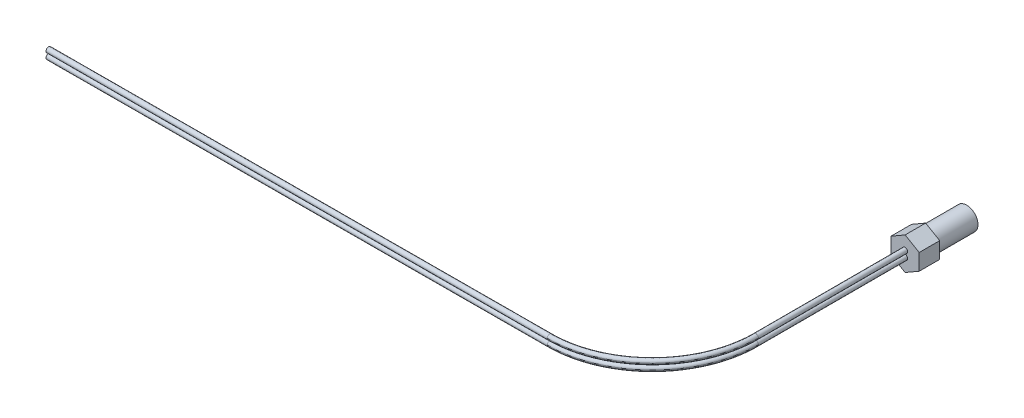
ISO-10303-21;
HEADER;
FILE_DESCRIPTION(('STEP AP214'),'2;1');
FILE_NAME('part.step','',(''),(''),'','','');
FILE_SCHEMA(('AUTOMOTIVE_DESIGN { 1 0 10303 214 1 1 1 1 }'));
ENDSEC;
DATA;
#1=APPLICATION_CONTEXT('core data for automotive mechanical design processes');
#2=APPLICATION_PROTOCOL_DEFINITION('international standard','automotive_design',2000,#1);
#3=PRODUCT_CONTEXT('',#1,'mechanical');
#4=PRODUCT('Part','Part','',(#3));
#5=PRODUCT_RELATED_PRODUCT_CATEGORY('part','',(#4));
#6=PRODUCT_DEFINITION_FORMATION('','',#4);
#7=PRODUCT_DEFINITION_CONTEXT('part definition',#1,'design');
#8=PRODUCT_DEFINITION('design','',#6,#7);
#9=PRODUCT_DEFINITION_SHAPE('','',#8);
#10=(LENGTH_UNIT() NAMED_UNIT(*) SI_UNIT(.MILLI.,.METRE.));
#11=(NAMED_UNIT(*) PLANE_ANGLE_UNIT() SI_UNIT($,.RADIAN.));
#12=(NAMED_UNIT(*) SI_UNIT($,.STERADIAN.) SOLID_ANGLE_UNIT());
#13=UNCERTAINTY_MEASURE_WITH_UNIT(LENGTH_MEASURE(1.E-05),#10,'distance_accuracy_value','');
#14=(GEOMETRIC_REPRESENTATION_CONTEXT(3) GLOBAL_UNCERTAINTY_ASSIGNED_CONTEXT((#13)) GLOBAL_UNIT_ASSIGNED_CONTEXT((#10,
#11,#12)) REPRESENTATION_CONTEXT('',''));
#15=CARTESIAN_POINT('',(0.,0.,0.));
#16=DIRECTION('',(0.,0.,1.));
#17=DIRECTION('',(1.,0.,0.));
#18=AXIS2_PLACEMENT_3D('',#15,#16,#17);
#19=CARTESIAN_POINT('',(-63.844812364,-5.756934303,26.31134491));
#20=DIRECTION('',(-0.999993047306047,-0.00372898639934052,-1.9388029138383E-10));
#21=DIRECTION('',(1.39051383204374E-05,-0.00372895849758769,0.999993047313415));
#22=AXIS2_PLACEMENT_3D('',#19,#20,#21);
#23=PLANE('',#22);
#24=CARTESIAN_POINT('',(-63.8457522724508,-5.5048812478937,26.565286584));
#25=DIRECTION('',(-0.99999304730823,-0.00372898581399768,0.));
#26=DIRECTION('',(0.00372898581399768,-0.99999304730823,0.));
#27=AXIS2_PLACEMENT_3D('',#24,#25,#26);
#28=CIRCLE('',#27,0.249999999225246);
#29=CARTESIAN_POINT('',(-63.8448200260002,-5.75487950894601,26.565286584));
#30=VERTEX_POINT('',#29);
#31=EDGE_CURVE('E74',#30,#30,#28,.T.);
#32=ORIENTED_EDGE('',*,*,#31,.T.);
#33=EDGE_LOOP('',(#32));
#34=FACE_BOUND('',#33,.T.);
#35=ADVANCED_FACE('F17',(#34),#23,.T.);
#36=CARTESIAN_POINT('',(-6.373051082,-5.792731412,0.));
#37=DIRECTION('',(1.,0.,0.));
#38=DIRECTION('',(0.,1.,0.));
#39=AXIS2_PLACEMENT_3D('',#36,#37,#38);
#40=PLANE('',#39);
#41=DIRECTION('',(0.,0.,1.));
#42=VECTOR('',#41,1.);
#43=CARTESIAN_POINT('',(-6.373051082,-5.792731412,1.));
#44=LINE('',#43,#42);
#45=CARTESIAN_POINT('',(-6.373051082,-5.79273141191554,0.));
#46=VERTEX_POINT('',#45);
#47=CARTESIAN_POINT('',(-6.373051082,-5.79273141191554,2.));
#48=VERTEX_POINT('',#47);
#49=EDGE_CURVE('E73',#46,#48,#44,.T.);
#50=ORIENTED_EDGE('',*,*,#49,.T.);
#51=DIRECTION('',(0.,-1.,0.));
#52=VECTOR('',#51,1.);
#53=CARTESIAN_POINT('',(-6.373051082,-5.,2.));
#54=LINE('',#53,#52);
#55=CARTESIAN_POINT('',(-6.373051082,-4.20726858816893,2.));
#56=VERTEX_POINT('',#55);
#57=EDGE_CURVE('E117',#56,#48,#54,.T.);
#58=ORIENTED_EDGE('',*,*,#57,.F.);
#59=DIRECTION('',(0.,0.,-1.));
#60=VECTOR('',#59,1.);
#61=CARTESIAN_POINT('',(-6.373051082,-4.207268588,1.));
#62=LINE('',#61,#60);
#63=CARTESIAN_POINT('',(-6.373051082,-4.20726858808446,0.));
#64=VERTEX_POINT('',#63);
#65=EDGE_CURVE('E99',#56,#64,#62,.T.);
#66=ORIENTED_EDGE('',*,*,#65,.T.);
#67=DIRECTION('',(0.,1.,0.));
#68=VECTOR('',#67,1.);
#69=CARTESIAN_POINT('',(-6.373051082,-5.,0.));
#70=LINE('',#69,#68);
#71=EDGE_CURVE('E114',#46,#64,#70,.T.);
#72=ORIENTED_EDGE('',*,*,#71,.F.);
#73=EDGE_LOOP('',(#50,#58,#66,#72));
#74=FACE_BOUND('',#73,.T.);
#75=ADVANCED_FACE('F364',(#74),#40,.F.);
#76=CARTESIAN_POINT('',(-6.1132,-6.1132,-4.));
#77=DIRECTION('',(0.,0.,1.));
#78=DIRECTION('',(1.,0.,0.));
#79=AXIS2_PLACEMENT_3D('',#76,#77,#78);
#80=PLANE('',#79);
#81=CARTESIAN_POINT('',(-5.,-5.,-4.));
#82=DIRECTION('',(0.,0.,1.));
#83=DIRECTION('',(1.,0.,0.));
#84=AXIS2_PLACEMENT_3D('',#81,#82,#83);
#85=CIRCLE('',#84,1.1);
#86=CARTESIAN_POINT('',(-3.9,-5.,-4.));
#87=VERTEX_POINT('',#86);
#88=EDGE_CURVE('E83',#87,#87,#85,.F.);
#89=ORIENTED_EDGE('',*,*,#88,.T.);
#90=EDGE_LOOP('',(#89));
#91=FACE_BOUND('',#90,.T.);
#92=ADVANCED_FACE('F355',(#91),#80,.F.);
#93=CARTESIAN_POINT('',(-15.0373229754504,-5.32287404200168,26.565286584));
#94=DIRECTION('',(-0.99999304730823,-0.00372898581399768,0.));
#95=DIRECTION('',(0.00372898581399768,-0.99999304730823,0.));
#96=AXIS2_PLACEMENT_3D('',#93,#94,#95);
#97=CYLINDRICAL_SURFACE('',#96,0.249999999225246);
#98=CARTESIAN_POINT('',(-15.0373229754504,-5.32287404200168,26.565286584));
#99=DIRECTION('',(-0.99999304730823,-0.00372898581399768,0.));
#100=DIRECTION('',(0.00372898581399768,-0.99999304730823,0.));
#101=AXIS2_PLACEMENT_3D('',#98,#99,#100);
#102=CIRCLE('',#101,0.249999999225246);
#103=CARTESIAN_POINT('',(-15.0373229754144,-5.32287404162219,26.8152865836054));
#104=VERTEX_POINT('',#103);
#105=CARTESIAN_POINT('',(-15.0373229754508,-5.32287404190551,26.3152865848017));
#106=VERTEX_POINT('',#105);
#107=EDGE_CURVE('E68',#104,#106,#102,.F.);
#108=ORIENTED_EDGE('',*,*,#107,.F.);
#109=CARTESIAN_POINT('',(-15.0373229754504,-5.32287404200168,26.565286584));
#110=DIRECTION('',(-0.99999304730823,-0.00372898581400086,0.));
#111=DIRECTION('',(0.00372898581399767,-0.99999304730823,0.));
#112=AXIS2_PLACEMENT_3D('',#109,#110,#111);
#113=CIRCLE('',#112,0.249999999171259);
#114=EDGE_CURVE('E64',#106,#104,#113,.F.);
#115=ORIENTED_EDGE('',*,*,#114,.F.);
#116=EDGE_LOOP('',(#108,#115));
#117=FACE_BOUND('',#116,.T.);
#118=ORIENTED_EDGE('',*,*,#31,.F.);
#119=EDGE_LOOP('',(#118));
#120=FACE_BOUND('',#119,.T.);
#121=ADVANCED_FACE('F66',(#117,#120),#97,.T.);
#122=CARTESIAN_POINT('',(-5.,-6.585462824,0.));
#123=DIRECTION('',(0.500000000092809,0.866025403730856,0.));
#124=DIRECTION('',(-0.866025403730856,0.500000000092809,0.));
#125=AXIS2_PLACEMENT_3D('',#122,#123,#124);
#126=PLANE('',#125);
#127=DIRECTION('',(0.,0.,1.));
#128=VECTOR('',#127,1.);
#129=CARTESIAN_POINT('',(-5.,-6.585462824,1.));
#130=LINE('',#129,#128);
#131=CARTESIAN_POINT('',(-5.,-6.585462824,0.));
#132=VERTEX_POINT('',#131);
#133=CARTESIAN_POINT('',(-5.00000000038747,-6.58546282360737,2.));
#134=VERTEX_POINT('',#133);
#135=EDGE_CURVE('E122',#132,#134,#130,.T.);
#136=ORIENTED_EDGE('',*,*,#135,.T.);
#137=DIRECTION('',(0.866025403730855,-0.500000000092808,0.));
#138=VECTOR('',#137,1.);
#139=CARTESIAN_POINT('',(-5.686525541,-6.189097118,2.));
#140=LINE('',#139,#138);
#141=EDGE_CURVE('E107',#48,#134,#140,.T.);
#142=ORIENTED_EDGE('',*,*,#141,.F.);
#143=ORIENTED_EDGE('',*,*,#49,.F.);
#144=DIRECTION('',(-0.866025403730855,0.500000000092808,0.));
#145=VECTOR('',#144,1.);
#146=CARTESIAN_POINT('',(-5.686525541,-6.189097118,0.));
#147=LINE('',#146,#145);
#148=EDGE_CURVE('E106',#132,#46,#147,.T.);
#149=ORIENTED_EDGE('',*,*,#148,.F.);
#150=EDGE_LOOP('',(#136,#142,#143,#149));
#151=FACE_BOUND('',#150,.T.);
#152=ADVANCED_FACE('F335',(#151),#126,.F.);
#153=CARTESIAN_POINT('',(-6.373051082,-4.207268588,0.));
#154=DIRECTION('',(0.500000000092809,-0.866025403730856,0.));
#155=DIRECTION('',(0.866025403730856,0.500000000092809,0.));
#156=AXIS2_PLACEMENT_3D('',#153,#154,#155);
#157=PLANE('',#156);
#158=ORIENTED_EDGE('',*,*,#65,.F.);
#159=DIRECTION('',(-0.866025403730855,-0.500000000092809,0.));
#160=VECTOR('',#159,1.);
#161=CARTESIAN_POINT('',(-5.686525541,-3.810902882,2.));
#162=LINE('',#161,#160);
#163=CARTESIAN_POINT('',(-4.99999999922506,-3.41453717678527,2.));
#164=VERTEX_POINT('',#163);
#165=EDGE_CURVE('E103',#164,#56,#162,.T.);
#166=ORIENTED_EDGE('',*,*,#165,.F.);
#167=DIRECTION('',(0.,0.,-1.));
#168=VECTOR('',#167,1.);
#169=CARTESIAN_POINT('',(-5.,-3.414537176,1.));
#170=LINE('',#169,#168);
#171=CARTESIAN_POINT('',(-5.,-3.414537176,0.));
#172=VERTEX_POINT('',#171);
#173=EDGE_CURVE('E130',#164,#172,#170,.T.);
#174=ORIENTED_EDGE('',*,*,#173,.T.);
#175=DIRECTION('',(0.866025403730855,0.500000000092809,0.));
#176=VECTOR('',#175,1.);
#177=CARTESIAN_POINT('',(-5.686525541,-3.810902882,0.));
#178=LINE('',#177,#176);
#179=EDGE_CURVE('E102',#64,#172,#178,.T.);
#180=ORIENTED_EDGE('',*,*,#179,.F.);
#181=EDGE_LOOP('',(#158,#166,#174,#180));
#182=FACE_BOUND('',#181,.T.);
#183=ADVANCED_FACE('F326',(#182),#157,.F.);
#184=CARTESIAN_POINT('',(-5.,-5.,-4.));
#185=DIRECTION('',(0.,0.,1.));
#186=DIRECTION('',(1.,0.,0.));
#187=AXIS2_PLACEMENT_3D('',#184,#185,#186);
#188=CYLINDRICAL_SURFACE('',#187,1.1);
#189=CARTESIAN_POINT('',(-5.,-5.,0.));
#190=DIRECTION('',(0.,0.,1.));
#191=DIRECTION('',(1.,0.,0.));
#192=AXIS2_PLACEMENT_3D('',#189,#190,#191);
#193=CIRCLE('',#192,1.1);
#194=CARTESIAN_POINT('',(-3.9,-5.,0.));
#195=VERTEX_POINT('',#194);
#196=EDGE_CURVE('E93',#195,#195,#193,.F.);
#197=ORIENTED_EDGE('',*,*,#196,.T.);
#198=EDGE_LOOP('',(#197));
#199=FACE_BOUND('',#198,.T.);
#200=ORIENTED_EDGE('',*,*,#88,.F.);
#201=EDGE_LOOP('',(#200));
#202=FACE_BOUND('',#201,.T.);
#203=ADVANCED_FACE('F317',(#199,#202),#188,.T.);
#204=CARTESIAN_POINT('',(-5.253690096,-5.261432232,16.532741571));
#205=CARTESIAN_POINT('',(-5.253690096,-5.261432232,22.263955388));
#206=CARTESIAN_POINT('',(-9.306242075,-5.276544246,26.316535543));
#207=CARTESIAN_POINT('',(-15.037416045,-5.297915861,26.316535543));
#208=CARTESIAN_POINT('',(-5.268909569,-5.419033425,16.532741571));
#209=CARTESIAN_POINT('',(-5.268909569,-5.419033425,22.254695827));
#210=CARTESIAN_POINT('',(-9.314914095,-5.434121024,26.300728483));
#211=CARTESIAN_POINT('',(-15.036828568,-5.45545811,26.300728483));
#212=CARTESIAN_POINT('',(-5.162248724,-5.536051512,16.532741571));
#213=CARTESIAN_POINT('',(-5.162248724,-5.536051512,22.316920256));
#214=CARTESIAN_POINT('',(-9.252252259,-5.551303183,26.406952228));
#215=CARTESIAN_POINT('',(-15.036390729,-5.572872303,26.406952228));
#216=CARTESIAN_POINT('',(-5.003915469,-5.535461085,16.532741571));
#217=CARTESIAN_POINT('',(-5.003915469,-5.535461085,22.409670375));
#218=CARTESIAN_POINT('',(-9.159502786,-5.550957319,26.565286584));
#219=CARTESIAN_POINT('',(-15.036390729,-5.572872303,26.565286584));
#220=CARTESIAN_POINT('',(-4.845582213,-5.534870659,16.532741571));
#221=CARTESIAN_POINT('',(-4.845582213,-5.534870659,22.502420493));
#222=CARTESIAN_POINT('',(-9.066753312,-5.550611455,26.723620941));
#223=CARTESIAN_POINT('',(-15.036390729,-5.572872303,26.723620941));
#224=CARTESIAN_POINT('',(-4.739797046,-5.417060359,16.532741571));
#225=CARTESIAN_POINT('',(-4.739797046,-5.417060359,22.564644922));
#226=CARTESIAN_POINT('',(-9.004967154,-5.432965228,26.829844685));
#227=CARTESIAN_POINT('',(-15.036828568,-5.45545811,26.829844685));
#228=CARTESIAN_POINT('',(-4.756191473,-5.259577054,16.532741571));
#229=CARTESIAN_POINT('',(-4.756191473,-5.259577054,22.555385361));
#230=CARTESIAN_POINT('',(-9.014814128,-5.275457508,26.814037626));
#231=CARTESIAN_POINT('',(-15.037416045,-5.297915861,26.814037626));
#232=(BOUNDED_SURFACE() B_SPLINE_SURFACE(3,3,((#204,#205,#206,#207),(#208,#209,#210,#211),(#212,
#213,#214,#215),(#216,#217,#218,#219),(#220,#221,#222,#223),(#224,#225,#226,#227),(#228,#229,
#230,#231)),.UNSPECIFIED.,.F.,.F.,.F.) B_SPLINE_SURFACE_WITH_KNOTS((4,3,4),(4,4),(0.,0.5,1.),
(0.,1.),.UNSPECIFIED.) GEOMETRIC_REPRESENTATION_ITEM() RATIONAL_B_SPLINE_SURFACE(((1.,
0.804737854124365,0.804737854124365,1.),(0.780588314885162,0.62816896547524,0.62816896547524,
0.780588314885162),(0.780588314885162,0.62816896547524,0.62816896547524,0.780588314885162),(1.,
0.804737854124365,0.804737854124365,1.),(0.780588314885162,0.62816896547524,0.62816896547524,
0.780588314885162),(0.780588314885162,0.62816896547524,0.62816896547524,0.780588314885162),(1.,
0.804737854124365,0.804737854124365,1.))) REPRESENTATION_ITEM('') SURFACE());
#233=CARTESIAN_POINT('',(-15.0373229753665,-5.32287404103142,16.532741571));
#234=DIRECTION('',(0.00372898580417677,-0.999993047308266,0.));
#235=DIRECTION('',(0.999993047308266,0.00372898580417677,0.));
#236=AXIS2_PLACEMENT_3D('',#233,#234,#235);
#237=CIRCLE('',#236,9.78254501315349);
#238=CARTESIAN_POINT('',(-5.25484597703009,-5.2863950699665,16.532741571));
#239=VERTEX_POINT('',#238);
#240=EDGE_CURVE('E80',#239,#106,#237,.T.);
#241=CARTESIAN_POINT('',(-5.004847715,-5.285462824,16.532741571));
#242=DIRECTION('',(0.,0.,-1.));
#243=DIRECTION('',(-1.,0.,0.));
#244=AXIS2_PLACEMENT_3D('',#241,#242,#243);
#245=CIRCLE('',#244,0.249999999999999);
#246=CARTESIAN_POINT('',(-4.75484945321532,-5.28453057718629,16.532741571));
#247=VERTEX_POINT('',#246);
#248=EDGE_CURVE('E82',#239,#247,#245,.F.);
#249=CARTESIAN_POINT('',(-15.0373229753667,-5.32287404096585,16.532741571));
#250=DIRECTION('',(-0.00372898577697807,0.999993047308368,0.));
#251=DIRECTION('',(-0.999993047308368,-0.00372898577697807,0.));
#252=AXIS2_PLACEMENT_3D('',#249,#250,#251);
#253=CIRCLE('',#252,10.2825450134738);
#254=EDGE_CURVE('E81',#104,#247,#253,.T.);
#255=ORIENTED_EDGE('',*,*,#240,.F.);
#256=ORIENTED_EDGE('',*,*,#248,.T.);
#257=ORIENTED_EDGE('',*,*,#254,.F.);
#258=ORIENTED_EDGE('',*,*,#107,.T.);
#259=EDGE_LOOP('',(#255,#256,#257,#258));
#260=FACE_BOUND('',#259,.T.);
#261=ADVANCED_FACE('F78',(#260),#232,.T.);
#262=CARTESIAN_POINT('',(-3.626948918,-5.792731412,0.));
#263=DIRECTION('',(-0.500000000092809,0.866025403730856,0.));
#264=DIRECTION('',(-0.866025403730856,-0.500000000092809,0.));
#265=AXIS2_PLACEMENT_3D('',#262,#263,#264);
#266=PLANE('',#265);
#267=DIRECTION('',(0.,0.,1.));
#268=VECTOR('',#267,1.);
#269=CARTESIAN_POINT('',(-3.626948918,-5.792731412,1.));
#270=LINE('',#269,#268);
#271=CARTESIAN_POINT('',(-3.626948918,-5.792731412,0.));
#272=VERTEX_POINT('',#271);
#273=CARTESIAN_POINT('',(-3.626948918,-5.79273141191554,2.));
#274=VERTEX_POINT('',#273);
#275=EDGE_CURVE('E88',#272,#274,#270,.T.);
#276=ORIENTED_EDGE('',*,*,#275,.T.);
#277=DIRECTION('',(0.866025403730856,0.500000000092809,0.));
#278=VECTOR('',#277,1.);
#279=CARTESIAN_POINT('',(-4.313474459,-6.189097118,2.));
#280=LINE('',#279,#278);
#281=EDGE_CURVE('E97',#134,#274,#280,.T.);
#282=ORIENTED_EDGE('',*,*,#281,.F.);
#283=ORIENTED_EDGE('',*,*,#135,.F.);
#284=DIRECTION('',(-0.866025403730856,-0.500000000092809,0.));
#285=VECTOR('',#284,1.);
#286=CARTESIAN_POINT('',(-3.626948918,-5.792731412,0.));
#287=LINE('',#286,#285);
#288=EDGE_CURVE('E133',#132,#272,#287,.F.);
#289=ORIENTED_EDGE('',*,*,#288,.T.);
#290=EDGE_LOOP('',(#276,#282,#283,#289));
#291=FACE_BOUND('',#290,.T.);
#292=ADVANCED_FACE('F297',(#291),#266,.F.);
#293=CARTESIAN_POINT('',(-5.,-3.414537176,0.));
#294=DIRECTION('',(-0.500000000092809,-0.866025403730856,0.));
#295=DIRECTION('',(0.866025403730855,-0.500000000092809,0.));
#296=AXIS2_PLACEMENT_3D('',#293,#294,#295);
#297=PLANE('',#296);
#298=ORIENTED_EDGE('',*,*,#173,.F.);
#299=DIRECTION('',(-0.866025403730856,0.500000000092809,0.));
#300=VECTOR('',#299,1.);
#301=CARTESIAN_POINT('',(-4.313474459,-3.810902882,2.));
#302=LINE('',#301,#300);
#303=CARTESIAN_POINT('',(-3.626948918,-4.20726858808446,2.));
#304=VERTEX_POINT('',#303);
#305=EDGE_CURVE('E134',#304,#164,#302,.T.);
#306=ORIENTED_EDGE('',*,*,#305,.F.);
#307=DIRECTION('',(0.,0.,-1.));
#308=VECTOR('',#307,1.);
#309=CARTESIAN_POINT('',(-3.626948918,-4.207268588,1.));
#310=LINE('',#309,#308);
#311=CARTESIAN_POINT('',(-3.626948918,-4.207268588,0.));
#312=VERTEX_POINT('',#311);
#313=EDGE_CURVE('E91',#304,#312,#310,.T.);
#314=ORIENTED_EDGE('',*,*,#313,.T.);
#315=DIRECTION('',(0.866025403730855,-0.500000000092809,0.));
#316=VECTOR('',#315,1.);
#317=CARTESIAN_POINT('',(-5.,-3.414537176,0.));
#318=LINE('',#317,#316);
#319=EDGE_CURVE('E148',#312,#172,#318,.F.);
#320=ORIENTED_EDGE('',*,*,#319,.T.);
#321=EDGE_LOOP('',(#298,#306,#314,#320));
#322=FACE_BOUND('',#321,.T.);
#323=ADVANCED_FACE('F288',(#322),#297,.F.);
#324=CARTESIAN_POINT('',(-6.373051082,-6.604488378,0.));
#325=DIRECTION('',(0.,0.,1.));
#326=DIRECTION('',(1.,0.,0.));
#327=AXIS2_PLACEMENT_3D('',#324,#325,#326);
#328=PLANE('',#327);
#329=ORIENTED_EDGE('',*,*,#196,.F.);
#330=EDGE_LOOP('',(#329));
#331=FACE_BOUND('',#330,.T.);
#332=DIRECTION('',(0.,-1.,0.));
#333=VECTOR('',#332,1.);
#334=CARTESIAN_POINT('',(-3.626948918,-5.,0.));
#335=LINE('',#334,#333);
#336=EDGE_CURVE('E125',#312,#272,#335,.T.);
#337=ORIENTED_EDGE('',*,*,#336,.T.);
#338=ORIENTED_EDGE('',*,*,#288,.F.);
#339=ORIENTED_EDGE('',*,*,#148,.T.);
#340=ORIENTED_EDGE('',*,*,#71,.T.);
#341=ORIENTED_EDGE('',*,*,#179,.T.);
#342=ORIENTED_EDGE('',*,*,#319,.F.);
#343=EDGE_LOOP('',(#337,#338,#339,#340,#341,#342));
#344=FACE_BOUND('',#343,.T.);
#345=ADVANCED_FACE('F279',(#331,#344),#328,.F.);
#346=CARTESIAN_POINT('',(-4.756005334,-5.309493415,16.532741571));
#347=CARTESIAN_POINT('',(-4.756005334,-5.309493415,22.555385361));
#348=CARTESIAN_POINT('',(-9.014627989,-5.325373869,26.814037626));
#349=CARTESIAN_POINT('',(-15.037229906,-5.347832222,26.814037626));
#350=CARTESIAN_POINT('',(-4.740785861,-5.151892222,16.532741571));
#351=CARTESIAN_POINT('',(-4.740785861,-5.151892222,22.564644922));
#352=CARTESIAN_POINT('',(-9.00595597,-5.167797091,26.829844685));
#353=CARTESIAN_POINT('',(-15.037817383,-5.190289973,26.829844685));
#354=CARTESIAN_POINT('',(-4.847446706,-5.034874135,16.532741571));
#355=CARTESIAN_POINT('',(-4.847446706,-5.034874135,22.502420493));
#356=CARTESIAN_POINT('',(-9.068617805,-5.050614932,26.723620941));
#357=CARTESIAN_POINT('',(-15.038255222,-5.07287578,26.723620941));
#358=CARTESIAN_POINT('',(-5.005779962,-5.035464562,16.532741571));
#359=CARTESIAN_POINT('',(-5.005779962,-5.035464562,22.409670375));
#360=CARTESIAN_POINT('',(-9.161367279,-5.050960796,26.565286584));
#361=CARTESIAN_POINT('',(-15.038255222,-5.07287578,26.565286584));
#362=CARTESIAN_POINT('',(-5.164113217,-5.036054988,16.532741571));
#363=CARTESIAN_POINT('',(-5.164113217,-5.036054988,22.316920256));
#364=CARTESIAN_POINT('',(-9.254116752,-5.05130666,26.406952228));
#365=CARTESIAN_POINT('',(-15.038255222,-5.07287578,26.406952228));
#366=CARTESIAN_POINT('',(-5.269898385,-5.153865289,16.532741571));
#367=CARTESIAN_POINT('',(-5.269898385,-5.153865289,22.254695827));
#368=CARTESIAN_POINT('',(-9.31590291,-5.168952887,26.300728483));
#369=CARTESIAN_POINT('',(-15.037817383,-5.190289973,26.300728483));
#370=CARTESIAN_POINT('',(-5.253503958,-5.311348593,16.532741571));
#371=CARTESIAN_POINT('',(-5.253503958,-5.311348593,22.263955388));
#372=CARTESIAN_POINT('',(-9.306055936,-5.326460607,26.316535543));
#373=CARTESIAN_POINT('',(-15.037229906,-5.347832222,26.316535543));
#374=(BOUNDED_SURFACE() B_SPLINE_SURFACE(3,3,((#346,#347,#348,#349),(#350,#351,#352,#353),(#354,
#355,#356,#357),(#358,#359,#360,#361),(#362,#363,#364,#365),(#366,#367,#368,#369),(#370,#371,
#372,#373)),.UNSPECIFIED.,.F.,.F.,.F.) B_SPLINE_SURFACE_WITH_KNOTS((4,3,4),(4,4),(0.,0.5,1.),
(0.,1.),.UNSPECIFIED.) GEOMETRIC_REPRESENTATION_ITEM() RATIONAL_B_SPLINE_SURFACE(((1.,
0.804737854124365,0.804737854124365,1.),(0.780588314885162,0.62816896547524,0.62816896547524,
0.780588314885162),(0.780588314885162,0.62816896547524,0.62816896547524,0.780588314885162),(1.,
0.804737854124365,0.804737854124365,1.),(0.780588314885162,0.62816896547524,0.62816896547524,
0.780588314885162),(0.780588314885162,0.62816896547524,0.62816896547524,0.780588314885162),(1.,
0.804737854124365,0.804737854124365,1.))) REPRESENTATION_ITEM('') SURFACE());
#375=CARTESIAN_POINT('',(-5.004847715,-5.285462824,16.532741571));
#376=DIRECTION('',(0.,0.,-1.));
#377=DIRECTION('',(-1.,0.,0.));
#378=AXIS2_PLACEMENT_3D('',#375,#376,#377);
#379=CIRCLE('',#378,0.249999999999999);
#380=EDGE_CURVE('E86',#247,#239,#379,.F.);
#381=ORIENTED_EDGE('',*,*,#114,.T.);
#382=ORIENTED_EDGE('',*,*,#254,.T.);
#383=ORIENTED_EDGE('',*,*,#380,.T.);
#384=ORIENTED_EDGE('',*,*,#240,.T.);
#385=EDGE_LOOP('',(#381,#382,#383,#384));
#386=FACE_BOUND('',#385,.T.);
#387=ADVANCED_FACE('F84',(#386),#374,.T.);
#388=CARTESIAN_POINT('',(-3.626948918,-4.207268588,0.));
#389=DIRECTION('',(-1.,0.,0.));
#390=DIRECTION('',(0.,-1.,0.));
#391=AXIS2_PLACEMENT_3D('',#388,#389,#390);
#392=PLANE('',#391);
#393=ORIENTED_EDGE('',*,*,#313,.F.);
#394=DIRECTION('',(0.,1.,0.));
#395=VECTOR('',#394,1.);
#396=CARTESIAN_POINT('',(-3.626948918,-5.,2.));
#397=LINE('',#396,#395);
#398=EDGE_CURVE('E145',#274,#304,#397,.T.);
#399=ORIENTED_EDGE('',*,*,#398,.F.);
#400=ORIENTED_EDGE('',*,*,#275,.F.);
#401=ORIENTED_EDGE('',*,*,#336,.F.);
#402=EDGE_LOOP('',(#393,#399,#400,#401));
#403=FACE_BOUND('',#402,.T.);
#404=ADVANCED_FACE('F261',(#403),#392,.F.);
#405=CARTESIAN_POINT('',(-5.004847715,-5.285462824,16.532741571));
#406=DIRECTION('',(0.,0.,-1.));
#407=DIRECTION('',(-1.,0.,0.));
#408=AXIS2_PLACEMENT_3D('',#405,#406,#407);
#409=CYLINDRICAL_SURFACE('',#408,0.249999999999999);
#410=CARTESIAN_POINT('',(-5.004847715,-5.285462824,2.));
#411=DIRECTION('',(0.,0.,-1.));
#412=DIRECTION('',(-1.,0.,0.));
#413=AXIS2_PLACEMENT_3D('',#410,#411,#412);
#414=CIRCLE('',#413,0.249999999999999);
#415=CARTESIAN_POINT('',(-5.254847715,-5.285462824,2.));
#416=VERTEX_POINT('',#415);
#417=EDGE_CURVE('E142',#416,#416,#414,.T.);
#418=ORIENTED_EDGE('',*,*,#417,.F.);
#419=EDGE_LOOP('',(#418));
#420=FACE_BOUND('',#419,.T.);
#421=ORIENTED_EDGE('',*,*,#380,.F.);
#422=ORIENTED_EDGE('',*,*,#248,.F.);
#423=EDGE_LOOP('',(#421,#422));
#424=FACE_BOUND('',#423,.T.);
#425=ADVANCED_FACE('F252',(#420,#424),#409,.T.);
#426=CARTESIAN_POINT('',(-63.846941323,-5.186016594,26.313473884));
#427=DIRECTION('',(-0.999993047313416,-0.00372898442308596,-1.93880342880045E-10));
#428=DIRECTION('',(1.39051383478153E-05,-0.00372896048121164,0.999993047306018));
#429=AXIS2_PLACEMENT_3D('',#426,#427,#428);
#430=PLANE('',#429);
#431=CARTESIAN_POINT('',(-63.8478812314546,-4.93396353889403,26.567415558));
#432=DIRECTION('',(-0.99999304730823,-0.00372898581400395,0.));
#433=DIRECTION('',(0.00372898581400395,-0.99999304730823,0.));
#434=AXIS2_PLACEMENT_3D('',#431,#432,#433);
#435=CIRCLE('',#434,0.250000000225085);
#436=CARTESIAN_POINT('',(-63.8469489850002,-5.18396180094617,26.567415558));
#437=VERTEX_POINT('',#436);
#438=EDGE_CURVE('E139',#437,#437,#435,.T.);
#439=ORIENTED_EDGE('',*,*,#438,.T.);
#440=EDGE_LOOP('',(#439));
#441=FACE_BOUND('',#440,.T.);
#442=ADVANCED_FACE('F196',(#441),#430,.T.);
#443=CARTESIAN_POINT('',(-6.373051082,-6.604488378,2.));
#444=DIRECTION('',(0.,0.,1.));
#445=DIRECTION('',(1.,0.,0.));
#446=AXIS2_PLACEMENT_3D('',#443,#444,#445);
#447=PLANE('',#446);
#448=ORIENTED_EDGE('',*,*,#417,.T.);
#449=EDGE_LOOP('',(#448));
#450=FACE_BOUND('',#449,.T.);
#451=CARTESIAN_POINT('',(-5.004847715,-4.714537176,2.));
#452=DIRECTION('',(0.,0.,-1.));
#453=DIRECTION('',(-1.,0.,0.));
#454=AXIS2_PLACEMENT_3D('',#451,#452,#453);
#455=CIRCLE('',#454,0.249999999999999);
#456=CARTESIAN_POINT('',(-5.254847715,-4.714537176,2.));
#457=VERTEX_POINT('',#456);
#458=EDGE_CURVE('E135',#457,#457,#455,.T.);
#459=ORIENTED_EDGE('',*,*,#458,.T.);
#460=EDGE_LOOP('',(#459));
#461=FACE_BOUND('',#460,.T.);
#462=ORIENTED_EDGE('',*,*,#281,.T.);
#463=ORIENTED_EDGE('',*,*,#398,.T.);
#464=ORIENTED_EDGE('',*,*,#305,.T.);
#465=ORIENTED_EDGE('',*,*,#165,.T.);
#466=ORIENTED_EDGE('',*,*,#57,.T.);
#467=ORIENTED_EDGE('',*,*,#141,.T.);
#468=EDGE_LOOP('',(#462,#463,#464,#465,#466,#467));
#469=FACE_BOUND('',#468,.T.);
#470=ADVANCED_FACE('F19',(#450,#461,#469),#447,.T.);
#471=CARTESIAN_POINT('',(-15.0394519344541,-4.75195633300169,26.567415558));
#472=DIRECTION('',(-0.99999304730823,-0.00372898581400395,0.));
#473=DIRECTION('',(0.00372898581400395,-0.99999304730823,0.));
#474=AXIS2_PLACEMENT_3D('',#471,#472,#473);
#475=CYLINDRICAL_SURFACE('',#474,0.250000000225085);
#476=ORIENTED_EDGE('',*,*,#438,.F.);
#477=EDGE_LOOP('',(#476));
#478=FACE_BOUND('',#477,.T.);
#479=CARTESIAN_POINT('',(-15.0394519344541,-4.75195633300169,26.567415558));
#480=DIRECTION('',(-0.99999304730823,-0.00372898581400395,0.));
#481=DIRECTION('',(0.00372898581400395,-0.99999304730823,0.));
#482=AXIS2_PLACEMENT_3D('',#479,#480,#481);
#483=CIRCLE('',#482,0.250000000225085);
#484=CARTESIAN_POINT('',(-15.0394519338266,-4.75195633333771,26.3174155579025));
#485=VERTEX_POINT('',#484);
#486=CARTESIAN_POINT('',(-15.0394519344543,-4.75195633295042,26.8174155581982));
#487=VERTEX_POINT('',#486);
#488=EDGE_CURVE('E160',#485,#487,#483,.F.);
#489=ORIENTED_EDGE('',*,*,#488,.F.);
#490=CARTESIAN_POINT('',(-15.0394519344541,-4.75195633300169,26.567415558));
#491=DIRECTION('',(-0.99999304730823,-0.00372898581400086,0.));
#492=DIRECTION('',(0.00372898581400047,-0.99999304730823,0.));
#493=AXIS2_PLACEMENT_3D('',#490,#491,#492);
#494=CIRCLE('',#493,0.250000000171251);
#495=EDGE_CURVE('E35',#487,#485,#494,.F.);
#496=ORIENTED_EDGE('',*,*,#495,.F.);
#497=EDGE_LOOP('',(#489,#496));
#498=FACE_BOUND('',#497,.T.);
#499=ADVANCED_FACE('F185',(#478,#498),#475,.T.);
#500=CARTESIAN_POINT('',(-5.004847715,-4.714537176,16.532741571));
#501=DIRECTION('',(0.,0.,-1.));
#502=DIRECTION('',(-1.,0.,0.));
#503=AXIS2_PLACEMENT_3D('',#500,#501,#502);
#504=CYLINDRICAL_SURFACE('',#503,0.249999999999999);
#505=ORIENTED_EDGE('',*,*,#458,.F.);
#506=EDGE_LOOP('',(#505));
#507=FACE_BOUND('',#506,.T.);
#508=CARTESIAN_POINT('',(-5.004847715,-4.714537176,16.532741571));
#509=DIRECTION('',(0.,0.,-1.));
#510=DIRECTION('',(-1.,0.,0.));
#511=AXIS2_PLACEMENT_3D('',#508,#509,#510);
#512=CIRCLE('',#511,0.249999999999999);
#513=CARTESIAN_POINT('',(-5.25484597669086,-4.71546942257869,16.532741571));
#514=VERTEX_POINT('',#513);
#515=CARTESIAN_POINT('',(-4.75484945326761,-4.71360492989934,16.532741571));
#516=VERTEX_POINT('',#515);
#517=EDGE_CURVE('E157',#514,#516,#512,.F.);
#518=ORIENTED_EDGE('',*,*,#517,.F.);
#519=CARTESIAN_POINT('',(-5.004847715,-4.714537176,16.532741571));
#520=DIRECTION('',(0.,0.,-1.));
#521=DIRECTION('',(-1.,0.,0.));
#522=AXIS2_PLACEMENT_3D('',#519,#520,#521);
#523=CIRCLE('',#522,0.249999999999999);
#524=EDGE_CURVE('E138',#516,#514,#523,.F.);
#525=ORIENTED_EDGE('',*,*,#524,.F.);
#526=EDGE_LOOP('',(#518,#525));
#527=FACE_BOUND('',#526,.T.);
#528=ADVANCED_FACE('F179',(#507,#527),#504,.T.);
#529=CARTESIAN_POINT('',(-4.756005334,-4.738567768,16.532741571));
#530=CARTESIAN_POINT('',(-4.756005334,-4.738567768,22.556632485));
#531=CARTESIAN_POINT('',(-9.015509833,-4.75445151,26.816166599));
#532=CARTESIAN_POINT('',(-15.039358865,-4.776914514,26.816166599));
#533=CARTESIAN_POINT('',(-4.740785861,-4.580966575,16.532741571));
#534=CARTESIAN_POINT('',(-4.740785861,-4.580966575,22.565892046));
#535=CARTESIAN_POINT('',(-9.006837813,-4.596874732,26.831973659));
#536=CARTESIAN_POINT('',(-15.039946342,-4.619372265,26.831973659));
#537=CARTESIAN_POINT('',(-4.847446706,-4.463948488,16.532741571));
#538=CARTESIAN_POINT('',(-4.847446706,-4.463948488,22.503667617));
#539=CARTESIAN_POINT('',(-9.069499648,-4.479692573,26.725749914));
#540=CARTESIAN_POINT('',(-15.04038418,-4.501958071,26.725749914));
#541=CARTESIAN_POINT('',(-5.005779962,-4.464538915,16.532741571));
#542=CARTESIAN_POINT('',(-5.005779962,-4.464538915,22.410917499));
#543=CARTESIAN_POINT('',(-9.162249122,-4.480038437,26.567415558));
#544=CARTESIAN_POINT('',(-15.04038418,-4.501958071,26.567415558));
#545=CARTESIAN_POINT('',(-5.164113217,-4.465129341,16.532741571));
#546=CARTESIAN_POINT('',(-5.164113217,-4.465129341,22.31816738));
#547=CARTESIAN_POINT('',(-9.254998596,-4.480384301,26.409081201));
#548=CARTESIAN_POINT('',(-15.04038418,-4.501958071,26.409081201));
#549=CARTESIAN_POINT('',(-5.269898385,-4.582939641,16.532741571));
#550=CARTESIAN_POINT('',(-5.269898385,-4.582939641,22.255942951));
#551=CARTESIAN_POINT('',(-9.316784753,-4.598030528,26.302857457));
#552=CARTESIAN_POINT('',(-15.039946342,-4.619372265,26.302857457));
#553=CARTESIAN_POINT('',(-5.253503958,-4.740422946,16.532741571));
#554=CARTESIAN_POINT('',(-5.253503958,-4.740422946,22.265202512));
#555=CARTESIAN_POINT('',(-9.30693778,-4.755538248,26.318664517));
#556=CARTESIAN_POINT('',(-15.039358865,-4.776914514,26.318664517));
#557=(BOUNDED_SURFACE() B_SPLINE_SURFACE(3,3,((#529,#530,#531,#532),(#533,#534,#535,#536),(#537,
#538,#539,#540),(#541,#542,#543,#544),(#545,#546,#547,#548),(#549,#550,#551,#552),(#553,#554,
#555,#556)),.UNSPECIFIED.,.F.,.F.,.F.) B_SPLINE_SURFACE_WITH_KNOTS((4,3,4),(4,4),(0.,0.5,1.),
(0.,1.),.UNSPECIFIED.) GEOMETRIC_REPRESENTATION_ITEM() RATIONAL_B_SPLINE_SURFACE(((1.,
0.804737854124365,0.804737854124365,1.),(0.780588314885162,0.628168965475239,0.628168965475239,
0.780588314885162),(0.780588314885162,0.628168965475239,0.628168965475239,0.780588314885162),
(1.,0.804737854124365,0.804737854124365,1.),(0.780588314885162,0.628168965475239,
0.628168965475239,0.780588314885162),(0.780588314885162,0.628168965475239,0.628168965475239,
0.780588314885162),(1.,0.804737854124365,0.804737854124365,1.))) REPRESENTATION_ITEM('') SURFACE());
#558=CARTESIAN_POINT('',(-15.0394519336428,-4.75195633420608,16.532741571));
#559=DIRECTION('',(-0.00372898589028077,0.999993047307945,0.));
#560=DIRECTION('',(-0.999993047307945,-0.00372898589028077,0.));
#561=AXIS2_PLACEMENT_3D('',#558,#559,#560);
#562=CIRCLE('',#561,9.78467398704998);
#563=EDGE_CURVE('E11',#485,#514,#562,.T.);
#564=CARTESIAN_POINT('',(-15.0394519336431,-4.75195633413287,16.532741571));
#565=DIRECTION('',(0.00372898585777298,-0.999993047308066,0.));
#566=DIRECTION('',(0.999993047308066,0.00372898585777298,0.));
#567=AXIS2_PLACEMENT_3D('',#564,#565,#566);
#568=CIRCLE('',#567,10.2846739864508);
#569=EDGE_CURVE('E27',#516,#487,#568,.T.);
#570=ORIENTED_EDGE('',*,*,#563,.F.);
#571=ORIENTED_EDGE('',*,*,#488,.T.);
#572=ORIENTED_EDGE('',*,*,#569,.F.);
#573=ORIENTED_EDGE('',*,*,#524,.T.);
#574=EDGE_LOOP('',(#570,#571,#572,#573));
#575=FACE_BOUND('',#574,.T.);
#576=ADVANCED_FACE('F173',(#575),#557,.T.);
#577=CARTESIAN_POINT('',(-5.253690096,-4.690506585,16.532741571));
#578=CARTESIAN_POINT('',(-5.253690096,-4.690506585,22.265202512));
#579=CARTESIAN_POINT('',(-9.307123918,-4.705621887,26.318664517));
#580=CARTESIAN_POINT('',(-15.039545003,-4.726998153,26.318664517));
#581=CARTESIAN_POINT('',(-5.268909569,-4.848107778,16.532741571));
#582=CARTESIAN_POINT('',(-5.268909569,-4.848107778,22.255942951));
#583=CARTESIAN_POINT('',(-9.315795938,-4.863198665,26.302857457));
#584=CARTESIAN_POINT('',(-15.038957526,-4.884540402,26.302857457));
#585=CARTESIAN_POINT('',(-5.162248724,-4.965125865,16.532741571));
#586=CARTESIAN_POINT('',(-5.162248724,-4.965125865,22.31816738));
#587=CARTESIAN_POINT('',(-9.253134103,-4.980380824,26.409081201));
#588=CARTESIAN_POINT('',(-15.038519688,-5.001954595,26.409081201));
#589=CARTESIAN_POINT('',(-5.003915469,-4.964535438,16.532741571));
#590=CARTESIAN_POINT('',(-5.003915469,-4.964535438,22.410917499));
#591=CARTESIAN_POINT('',(-9.160384629,-4.98003496,26.567415558));
#592=CARTESIAN_POINT('',(-15.038519688,-5.001954595,26.567415558));
#593=CARTESIAN_POINT('',(-4.845582213,-4.963945012,16.532741571));
#594=CARTESIAN_POINT('',(-4.845582213,-4.963945012,22.503667617));
#595=CARTESIAN_POINT('',(-9.067635155,-4.979689097,26.725749914));
#596=CARTESIAN_POINT('',(-15.038519688,-5.001954595,26.725749914));
#597=CARTESIAN_POINT('',(-4.739797046,-4.846134711,16.532741571));
#598=CARTESIAN_POINT('',(-4.739797046,-4.846134711,22.565892046));
#599=CARTESIAN_POINT('',(-9.005848998,-4.862042869,26.831973659));
#600=CARTESIAN_POINT('',(-15.038957526,-4.884540402,26.831973659));
#601=CARTESIAN_POINT('',(-4.756191473,-4.688651407,16.532741571));
#602=CARTESIAN_POINT('',(-4.756191473,-4.688651407,22.556632485));
#603=CARTESIAN_POINT('',(-9.015695972,-4.704535149,26.816166599));
#604=CARTESIAN_POINT('',(-15.039545003,-4.726998153,26.816166599));
#605=(BOUNDED_SURFACE() B_SPLINE_SURFACE(3,3,((#577,#578,#579,#580),(#581,#582,#583,#584),(#585,
#586,#587,#588),(#589,#590,#591,#592),(#593,#594,#595,#596),(#597,#598,#599,#600),(#601,#602,
#603,#604)),.UNSPECIFIED.,.F.,.F.,.F.) B_SPLINE_SURFACE_WITH_KNOTS((4,3,4),(4,4),(0.,0.5,1.),
(0.,1.),.UNSPECIFIED.) GEOMETRIC_REPRESENTATION_ITEM() RATIONAL_B_SPLINE_SURFACE(((1.,
0.804737854124365,0.804737854124365,1.),(0.780588314885163,0.62816896547524,0.62816896547524,
0.780588314885163),(0.780588314885163,0.62816896547524,0.62816896547524,0.780588314885163),(1.,
0.804737854124365,0.804737854124365,1.),(0.780588314885163,0.62816896547524,0.62816896547524,
0.780588314885163),(0.780588314885163,0.62816896547524,0.62816896547524,0.780588314885163),(1.,
0.804737854124365,0.804737854124365,1.))) REPRESENTATION_ITEM('') SURFACE());
#606=ORIENTED_EDGE('',*,*,#563,.T.);
#607=ORIENTED_EDGE('',*,*,#517,.T.);
#608=ORIENTED_EDGE('',*,*,#569,.T.);
#609=ORIENTED_EDGE('',*,*,#495,.T.);
#610=EDGE_LOOP('',(#606,#607,#608,#609));
#611=FACE_BOUND('',#610,.T.);
#612=ADVANCED_FACE('F181',(#611),#605,.T.);
#613=CLOSED_SHELL('',(#35,#75,#92,#121,#152,#183,#203,#261,#292,#323,#345,#387,#404,#425,#442,
#470,#499,#528,#576,#612));
#614=MANIFOLD_SOLID_BREP('B1',#613);
#615=ADVANCED_BREP_SHAPE_REPRESENTATION('',(#18,#614),#14);
#616=SHAPE_DEFINITION_REPRESENTATION(#9,#615);
ENDSEC;
END-ISO-10303-21;
